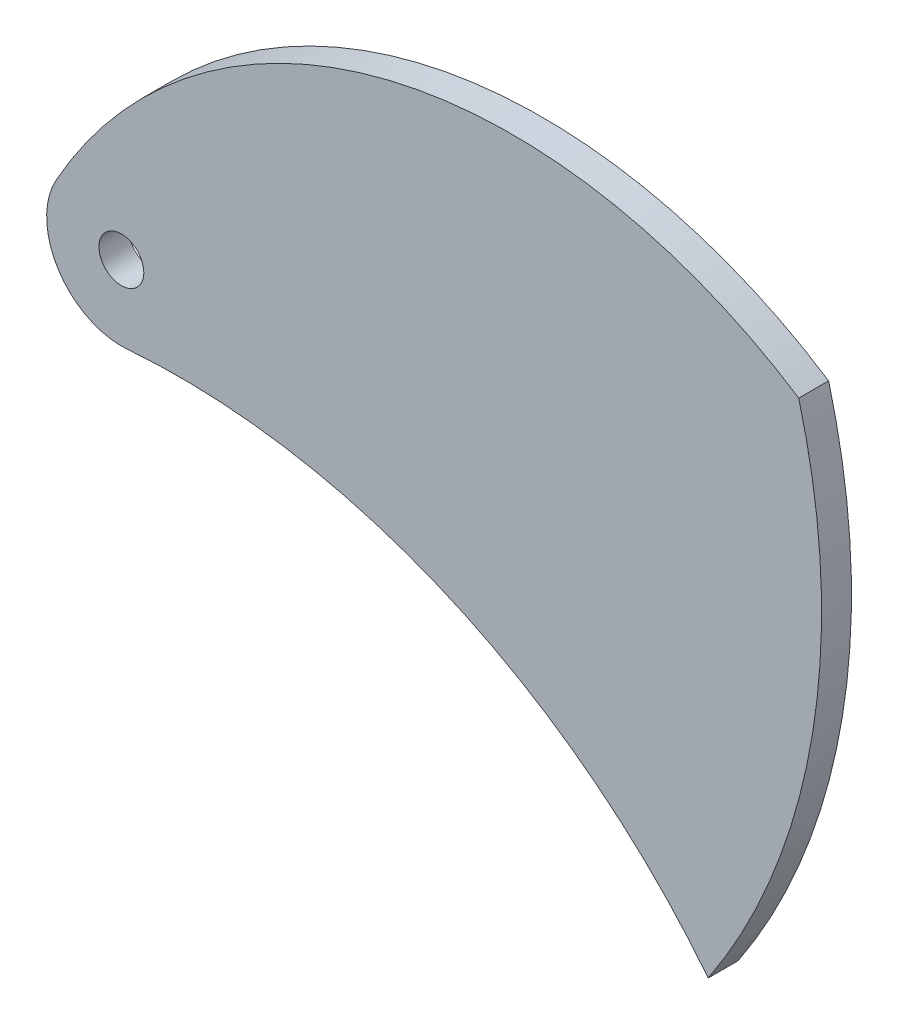
ISO-10303-21;
HEADER;
FILE_DESCRIPTION(('STEP AP214'),'2;1');
FILE_NAME('part.step','',(''),(''),'','','');
FILE_SCHEMA(('AUTOMOTIVE_DESIGN { 1 0 10303 214 1 1 1 1 }'));
ENDSEC;
DATA;
#1=APPLICATION_CONTEXT('core data for automotive mechanical design processes');
#2=APPLICATION_PROTOCOL_DEFINITION('international standard','automotive_design',2000,#1);
#3=PRODUCT_CONTEXT('',#1,'mechanical');
#4=PRODUCT('Part','Part','',(#3));
#5=PRODUCT_RELATED_PRODUCT_CATEGORY('part','',(#4));
#6=PRODUCT_DEFINITION_FORMATION('','',#4);
#7=PRODUCT_DEFINITION_CONTEXT('part definition',#1,'design');
#8=PRODUCT_DEFINITION('design','',#6,#7);
#9=PRODUCT_DEFINITION_SHAPE('','',#8);
#10=(LENGTH_UNIT() NAMED_UNIT(*) SI_UNIT(.MILLI.,.METRE.));
#11=(NAMED_UNIT(*) PLANE_ANGLE_UNIT() SI_UNIT($,.RADIAN.));
#12=(NAMED_UNIT(*) SI_UNIT($,.STERADIAN.) SOLID_ANGLE_UNIT());
#13=UNCERTAINTY_MEASURE_WITH_UNIT(LENGTH_MEASURE(1.E-05),#10,'distance_accuracy_value','');
#14=(GEOMETRIC_REPRESENTATION_CONTEXT(3) GLOBAL_UNCERTAINTY_ASSIGNED_CONTEXT((#13)) GLOBAL_UNIT_ASSIGNED_CONTEXT((#10,
#11,#12)) REPRESENTATION_CONTEXT('',''));
#15=CARTESIAN_POINT('',(0.,0.,0.));
#16=DIRECTION('',(0.,0.,1.));
#17=DIRECTION('',(1.,0.,0.));
#18=AXIS2_PLACEMENT_3D('',#15,#16,#17);
#19=CARTESIAN_POINT('',(-13.0878282264331,7.32862554067146,2.));
#20=DIRECTION('',(0.,0.,-1.));
#21=DIRECTION('',(-1.,0.,0.));
#22=AXIS2_PLACEMENT_3D('',#19,#20,#21);
#23=CYLINDRICAL_SURFACE('',#22,35.);
#24=CARTESIAN_POINT('',(-13.0878282264331,7.32862554067146,0.));
#25=DIRECTION('',(0.,0.,1.));
#26=DIRECTION('',(1.,0.,0.));
#27=AXIS2_PLACEMENT_3D('',#24,#25,#26);
#28=CIRCLE('',#27,35.);
#29=CARTESIAN_POINT('',(-43.6260940881105,24.4287518022377,0.));
#30=VERTEX_POINT('',#29);
#31=CARTESIAN_POINT('',(6.05461915642895,36.6299345249875,0.));
#32=VERTEX_POINT('',#31);
#33=EDGE_CURVE('E101',#30,#32,#28,.F.);
#34=ORIENTED_EDGE('',*,*,#33,.F.);
#35=DIRECTION('',(0.,0.,-1.));
#36=VECTOR('',#35,1.);
#37=CARTESIAN_POINT('',(-43.6260940881105,24.4287518022377,2.));
#38=LINE('',#37,#36);
#39=CARTESIAN_POINT('',(-43.6260940881105,24.4287518022377,2.));
#40=VERTEX_POINT('',#39);
#41=EDGE_CURVE('E11',#40,#30,#38,.T.);
#42=ORIENTED_EDGE('',*,*,#41,.F.);
#43=CARTESIAN_POINT('',(-13.0878282264331,7.32862554067146,2.));
#44=DIRECTION('',(0.,0.,1.));
#45=DIRECTION('',(1.,0.,0.));
#46=AXIS2_PLACEMENT_3D('',#43,#44,#45);
#47=CIRCLE('',#46,35.);
#48=CARTESIAN_POINT('',(6.05461915642895,36.6299345249875,2.));
#49=VERTEX_POINT('',#48);
#50=EDGE_CURVE('E86',#40,#49,#47,.F.);
#51=ORIENTED_EDGE('',*,*,#50,.T.);
#52=DIRECTION('',(0.,0.,-1.));
#53=VECTOR('',#52,1.);
#54=CARTESIAN_POINT('',(6.05461915642895,36.6299345249875,2.));
#55=LINE('',#54,#53);
#56=EDGE_CURVE('E74',#49,#32,#55,.T.);
#57=ORIENTED_EDGE('',*,*,#56,.T.);
#58=EDGE_LOOP('',(#34,#42,#51,#57));
#59=FACE_BOUND('',#58,.T.);
#60=ADVANCED_FACE('F35',(#59),#23,.T.);
#61=CARTESIAN_POINT('',(-39.2634846792994,21.985876622014,2.));
#62=DIRECTION('',(0.,0.,-1.));
#63=DIRECTION('',(-1.,0.,0.));
#64=AXIS2_PLACEMENT_3D('',#61,#62,#63);
#65=CYLINDRICAL_SURFACE('',#64,4.99999999999999);
#66=CARTESIAN_POINT('',(-39.2634846792994,21.985876622014,0.));
#67=DIRECTION('',(0.,0.,1.));
#68=DIRECTION('',(1.,0.,0.));
#69=AXIS2_PLACEMENT_3D('',#66,#67,#68);
#70=CIRCLE('',#69,4.99999999999999);
#71=CARTESIAN_POINT('',(-38.8710132217491,17.0013038063147,0.));
#72=VERTEX_POINT('',#71);
#73=EDGE_CURVE('E91',#30,#72,#70,.T.);
#74=ORIENTED_EDGE('',*,*,#73,.T.);
#75=DIRECTION('',(0.,0.,-1.));
#76=VECTOR('',#75,1.);
#77=CARTESIAN_POINT('',(-38.8710132217491,17.0013038063147,2.));
#78=LINE('',#77,#76);
#79=CARTESIAN_POINT('',(-38.8710132217491,17.0013038063147,2.));
#80=VERTEX_POINT('',#79);
#81=EDGE_CURVE('E43',#80,#72,#78,.T.);
#82=ORIENTED_EDGE('',*,*,#81,.F.);
#83=CARTESIAN_POINT('',(-39.2634846792994,21.985876622014,2.));
#84=DIRECTION('',(0.,0.,1.));
#85=DIRECTION('',(1.,0.,0.));
#86=AXIS2_PLACEMENT_3D('',#83,#84,#85);
#87=CIRCLE('',#86,4.99999999999999);
#88=EDGE_CURVE('E80',#40,#80,#87,.T.);
#89=ORIENTED_EDGE('',*,*,#88,.F.);
#90=ORIENTED_EDGE('',*,*,#41,.T.);
#91=EDGE_LOOP('',(#74,#82,#89,#90));
#92=FACE_BOUND('',#91,.T.);
#93=ADVANCED_FACE('F89',(#92),#65,.T.);
#94=CARTESIAN_POINT('',(-35.3387701037959,-27.8598515349789,2.));
#95=DIRECTION('',(0.,0.,-1.));
#96=DIRECTION('',(-1.,0.,0.));
#97=AXIS2_PLACEMENT_3D('',#94,#95,#96);
#98=CYLINDRICAL_SURFACE('',#97,45.);
#99=CARTESIAN_POINT('',(-35.3387701037959,-27.8598515349789,0.));
#100=DIRECTION('',(0.,0.,1.));
#101=DIRECTION('',(1.,0.,0.));
#102=AXIS2_PLACEMENT_3D('',#99,#100,#101);
#103=CIRCLE('',#102,45.);
#104=CARTESIAN_POINT('',(0.,0.,0.));
#105=VERTEX_POINT('',#104);
#106=EDGE_CURVE('E67',#72,#105,#103,.F.);
#107=ORIENTED_EDGE('',*,*,#106,.T.);
#108=DIRECTION('',(0.,0.,-1.));
#109=VECTOR('',#108,1.);
#110=CARTESIAN_POINT('',(0.,0.,2.));
#111=LINE('',#110,#109);
#112=CARTESIAN_POINT('',(0.,0.,2.));
#113=VERTEX_POINT('',#112);
#114=EDGE_CURVE('E92',#113,#105,#111,.T.);
#115=ORIENTED_EDGE('',*,*,#114,.F.);
#116=CARTESIAN_POINT('',(-35.3387701037959,-27.8598515349789,2.));
#117=DIRECTION('',(0.,0.,1.));
#118=DIRECTION('',(1.,0.,0.));
#119=AXIS2_PLACEMENT_3D('',#116,#117,#118);
#120=CIRCLE('',#119,45.);
#121=EDGE_CURVE('E85',#80,#113,#120,.F.);
#122=ORIENTED_EDGE('',*,*,#121,.F.);
#123=ORIENTED_EDGE('',*,*,#81,.T.);
#124=EDGE_LOOP('',(#107,#115,#122,#123));
#125=FACE_BOUND('',#124,.T.);
#126=ADVANCED_FACE('F93',(#125),#98,.F.);
#127=CARTESIAN_POINT('',(-37.4165738677394,25.,2.));
#128=DIRECTION('',(0.,0.,-1.));
#129=DIRECTION('',(-1.,0.,0.));
#130=AXIS2_PLACEMENT_3D('',#127,#128,#129);
#131=CYLINDRICAL_SURFACE('',#130,45.);
#132=CARTESIAN_POINT('',(-37.4165738677394,25.,0.));
#133=DIRECTION('',(0.,0.,1.));
#134=DIRECTION('',(1.,0.,0.));
#135=AXIS2_PLACEMENT_3D('',#132,#133,#134);
#136=CIRCLE('',#135,45.);
#137=EDGE_CURVE('E106',#105,#32,#136,.T.);
#138=ORIENTED_EDGE('',*,*,#137,.T.);
#139=ORIENTED_EDGE('',*,*,#56,.F.);
#140=CARTESIAN_POINT('',(-37.4165738677394,25.,2.));
#141=DIRECTION('',(0.,0.,1.));
#142=DIRECTION('',(1.,0.,0.));
#143=AXIS2_PLACEMENT_3D('',#140,#141,#142);
#144=CIRCLE('',#143,45.);
#145=EDGE_CURVE('E51',#113,#49,#144,.T.);
#146=ORIENTED_EDGE('',*,*,#145,.F.);
#147=ORIENTED_EDGE('',*,*,#114,.T.);
#148=EDGE_LOOP('',(#138,#139,#146,#147));
#149=FACE_BOUND('',#148,.T.);
#150=ADVANCED_FACE('F114',(#149),#131,.T.);
#151=CARTESIAN_POINT('',(-39.2634846792994,21.985876622014,2.));
#152=DIRECTION('',(0.,0.,-1.));
#153=DIRECTION('',(-1.,0.,0.));
#154=AXIS2_PLACEMENT_3D('',#151,#152,#153);
#155=CYLINDRICAL_SURFACE('',#154,1.5);
#156=CARTESIAN_POINT('',(-39.2634846792994,21.985876622014,2.));
#157=DIRECTION('',(0.,0.,1.));
#158=DIRECTION('',(1.,0.,0.));
#159=AXIS2_PLACEMENT_3D('',#156,#157,#158);
#160=CIRCLE('',#159,1.5);
#161=CARTESIAN_POINT('',(-37.7634846792994,21.985876622014,2.));
#162=VERTEX_POINT('',#161);
#163=EDGE_CURVE('E95',#162,#162,#160,.T.);
#164=ORIENTED_EDGE('',*,*,#163,.T.);
#165=EDGE_LOOP('',(#164));
#166=FACE_BOUND('',#165,.T.);
#167=CARTESIAN_POINT('',(-39.2634846792994,21.985876622014,0.));
#168=DIRECTION('',(0.,0.,1.));
#169=DIRECTION('',(1.,0.,0.));
#170=AXIS2_PLACEMENT_3D('',#167,#168,#169);
#171=CIRCLE('',#170,1.5);
#172=CARTESIAN_POINT('',(-37.7634846792994,21.985876622014,0.));
#173=VERTEX_POINT('',#172);
#174=EDGE_CURVE('E108',#173,#173,#171,.T.);
#175=ORIENTED_EDGE('',*,*,#174,.F.);
#176=EDGE_LOOP('',(#175));
#177=FACE_BOUND('',#176,.T.);
#178=ADVANCED_FACE('F129',(#166,#177),#155,.F.);
#179=CARTESIAN_POINT('',(0.,0.,2.));
#180=DIRECTION('',(0.,0.,1.));
#181=DIRECTION('',(1.,0.,0.));
#182=AXIS2_PLACEMENT_3D('',#179,#180,#181);
#183=PLANE('',#182);
#184=ORIENTED_EDGE('',*,*,#50,.F.);
#185=ORIENTED_EDGE('',*,*,#88,.T.);
#186=ORIENTED_EDGE('',*,*,#121,.T.);
#187=ORIENTED_EDGE('',*,*,#145,.T.);
#188=EDGE_LOOP('',(#184,#185,#186,#187));
#189=FACE_BOUND('',#188,.T.);
#190=ORIENTED_EDGE('',*,*,#163,.F.);
#191=EDGE_LOOP('',(#190));
#192=FACE_BOUND('',#191,.T.);
#193=ADVANCED_FACE('F82',(#189,#192),#183,.T.);
#194=CARTESIAN_POINT('',(0.,0.,0.));
#195=DIRECTION('',(0.,0.,1.));
#196=DIRECTION('',(1.,0.,0.));
#197=AXIS2_PLACEMENT_3D('',#194,#195,#196);
#198=PLANE('',#197);
#199=ORIENTED_EDGE('',*,*,#33,.T.);
#200=ORIENTED_EDGE('',*,*,#137,.F.);
#201=ORIENTED_EDGE('',*,*,#106,.F.);
#202=ORIENTED_EDGE('',*,*,#73,.F.);
#203=EDGE_LOOP('',(#199,#200,#201,#202));
#204=FACE_BOUND('',#203,.T.);
#205=ORIENTED_EDGE('',*,*,#174,.T.);
#206=EDGE_LOOP('',(#205));
#207=FACE_BOUND('',#206,.T.);
#208=ADVANCED_FACE('F116',(#204,#207),#198,.F.);
#209=CLOSED_SHELL('',(#60,#93,#126,#150,#178,#193,#208));
#210=MANIFOLD_SOLID_BREP('B2',#209);
#211=ADVANCED_BREP_SHAPE_REPRESENTATION('',(#18,#210),#14);
#212=SHAPE_DEFINITION_REPRESENTATION(#9,#211);
ENDSEC;
END-ISO-10303-21;
